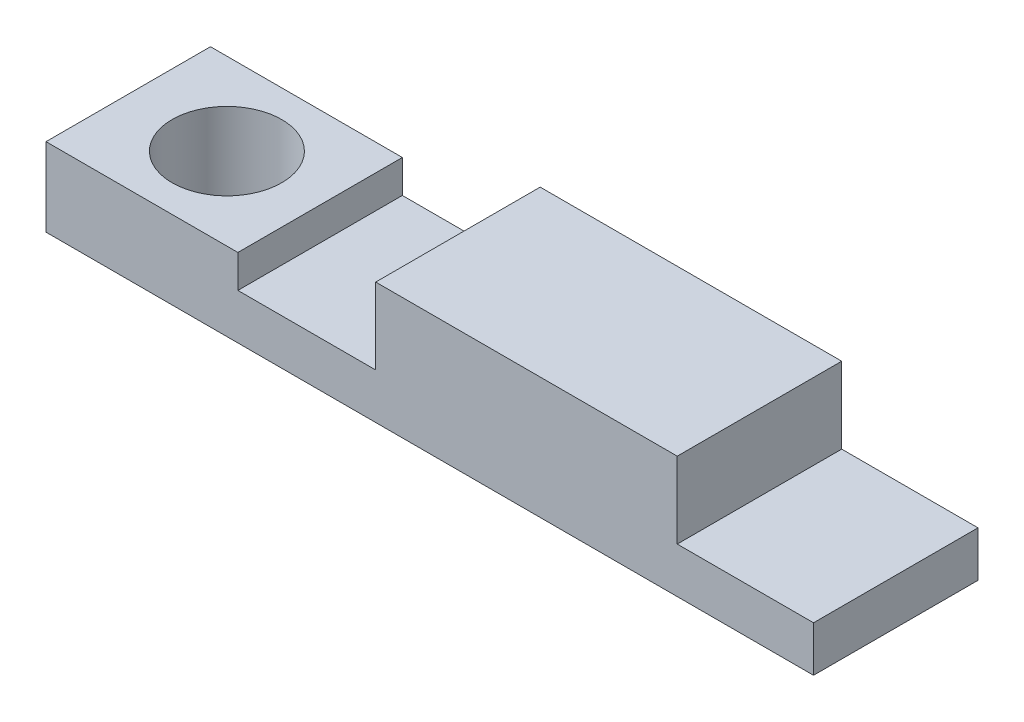
ISO-10303-21;
HEADER;
FILE_DESCRIPTION(('STEP AP214'),'2;1');
FILE_NAME('part.step','',(''),(''),'','','');
FILE_SCHEMA(('AUTOMOTIVE_DESIGN { 1 0 10303 214 1 1 1 1 }'));
ENDSEC;
DATA;
#1=APPLICATION_CONTEXT('core data for automotive mechanical design processes');
#2=APPLICATION_PROTOCOL_DEFINITION('international standard','automotive_design',2000,#1);
#3=PRODUCT_CONTEXT('',#1,'mechanical');
#4=PRODUCT('Part','Part','',(#3));
#5=PRODUCT_RELATED_PRODUCT_CATEGORY('part','',(#4));
#6=PRODUCT_DEFINITION_FORMATION('','',#4);
#7=PRODUCT_DEFINITION_CONTEXT('part definition',#1,'design');
#8=PRODUCT_DEFINITION('design','',#6,#7);
#9=PRODUCT_DEFINITION_SHAPE('','',#8);
#10=(LENGTH_UNIT() NAMED_UNIT(*) SI_UNIT(.MILLI.,.METRE.));
#11=(NAMED_UNIT(*) PLANE_ANGLE_UNIT() SI_UNIT($,.RADIAN.));
#12=(NAMED_UNIT(*) SI_UNIT($,.STERADIAN.) SOLID_ANGLE_UNIT());
#13=UNCERTAINTY_MEASURE_WITH_UNIT(LENGTH_MEASURE(1.E-05),#10,'distance_accuracy_value','');
#14=(GEOMETRIC_REPRESENTATION_CONTEXT(3) GLOBAL_UNCERTAINTY_ASSIGNED_CONTEXT((#13)) GLOBAL_UNIT_ASSIGNED_CONTEXT((#10,
#11,#12)) REPRESENTATION_CONTEXT('',''));
#15=CARTESIAN_POINT('',(0.,0.,0.));
#16=DIRECTION('',(0.,0.,1.));
#17=DIRECTION('',(1.,0.,0.));
#18=AXIS2_PLACEMENT_3D('',#15,#16,#17);
#19=CARTESIAN_POINT('',(0.,8.3,0.));
#20=DIRECTION('',(0.,-1.,0.));
#21=DIRECTION('',(0.,0.,-1.));
#22=AXIS2_PLACEMENT_3D('',#19,#20,#21);
#23=PLANE('',#22);
#24=DIRECTION('',(0.,0.,1.));
#25=VECTOR('',#24,1.);
#26=CARTESIAN_POINT('',(60.14,8.3,-30.));
#27=LINE('',#26,#25);
#28=CARTESIAN_POINT('',(60.14,8.3,-30.));
#29=VERTEX_POINT('',#28);
#30=CARTESIAN_POINT('',(60.14,8.3,0.));
#31=VERTEX_POINT('',#30);
#32=EDGE_CURVE('E120',#29,#31,#27,.T.);
#33=ORIENTED_EDGE('',*,*,#32,.F.);
#34=DIRECTION('',(-1.,0.,0.));
#35=VECTOR('',#34,1.);
#36=CARTESIAN_POINT('',(0.,8.3,-30.));
#37=LINE('',#36,#35);
#38=CARTESIAN_POINT('',(35.,8.3,-30.));
#39=VERTEX_POINT('',#38);
#40=EDGE_CURVE('E192',#29,#39,#37,.T.);
#41=ORIENTED_EDGE('',*,*,#40,.T.);
#42=DIRECTION('',(0.,0.,-1.));
#43=VECTOR('',#42,1.);
#44=CARTESIAN_POINT('',(35.,8.3,0.));
#45=LINE('',#44,#43);
#46=CARTESIAN_POINT('',(35.,8.3,0.));
#47=VERTEX_POINT('',#46);
#48=EDGE_CURVE('E161',#47,#39,#45,.T.);
#49=ORIENTED_EDGE('',*,*,#48,.F.);
#50=DIRECTION('',(1.,0.,0.));
#51=VECTOR('',#50,1.);
#52=CARTESIAN_POINT('',(0.,8.3,0.));
#53=LINE('',#52,#51);
#54=EDGE_CURVE('E59',#47,#31,#53,.T.);
#55=ORIENTED_EDGE('',*,*,#54,.T.);
#56=EDGE_LOOP('',(#33,#41,#49,#55));
#57=FACE_BOUND('',#56,.T.);
#58=ADVANCED_FACE('F33',(#57),#23,.F.);
#59=DIRECTION('',(0.,0.,-1.));
#60=VECTOR('',#59,1.);
#61=CARTESIAN_POINT('',(115.14,8.3,-30.));
#62=LINE('',#61,#60);
#63=CARTESIAN_POINT('',(115.14,8.3,0.));
#64=VERTEX_POINT('',#63);
#65=CARTESIAN_POINT('',(115.14,8.3,-30.));
#66=VERTEX_POINT('',#65);
#67=EDGE_CURVE('E51',#64,#66,#62,.T.);
#68=ORIENTED_EDGE('',*,*,#67,.F.);
#69=CARTESIAN_POINT('',(140.,8.3,0.));
#70=VERTEX_POINT('',#69);
#71=EDGE_CURVE('E37',#64,#70,#53,.T.);
#72=ORIENTED_EDGE('',*,*,#71,.T.);
#73=DIRECTION('',(0.,0.,-1.));
#74=VECTOR('',#73,1.);
#75=CARTESIAN_POINT('',(140.,8.3,0.));
#76=LINE('',#75,#74);
#77=CARTESIAN_POINT('',(140.,8.3,-30.));
#78=VERTEX_POINT('',#77);
#79=EDGE_CURVE('E193',#70,#78,#76,.T.);
#80=ORIENTED_EDGE('',*,*,#79,.T.);
#81=EDGE_CURVE('E180',#78,#66,#37,.T.);
#82=ORIENTED_EDGE('',*,*,#81,.T.);
#83=EDGE_LOOP('',(#68,#72,#80,#82));
#84=FACE_BOUND('',#83,.T.);
#85=ADVANCED_FACE('F213',(#84),#23,.F.);
#86=CARTESIAN_POINT('',(0.,0.,0.));
#87=DIRECTION('',(0.,-1.,0.));
#88=DIRECTION('',(0.,0.,-1.));
#89=AXIS2_PLACEMENT_3D('',#86,#87,#88);
#90=PLANE('',#89);
#91=CARTESIAN_POINT('',(18.,0.,-15.));
#92=DIRECTION('',(0.,1.,0.));
#93=DIRECTION('',(0.,0.,1.));
#94=AXIS2_PLACEMENT_3D('',#91,#92,#93);
#95=CIRCLE('',#94,10.);
#96=CARTESIAN_POINT('',(18.,0.,-5.));
#97=VERTEX_POINT('',#96);
#98=EDGE_CURVE('E155',#97,#97,#95,.T.);
#99=ORIENTED_EDGE('',*,*,#98,.T.);
#100=EDGE_LOOP('',(#99));
#101=FACE_BOUND('',#100,.T.);
#102=DIRECTION('',(0.,0.,1.));
#103=VECTOR('',#102,1.);
#104=CARTESIAN_POINT('',(0.,0.,0.));
#105=LINE('',#104,#103);
#106=CARTESIAN_POINT('',(0.,0.,-30.));
#107=VERTEX_POINT('',#106);
#108=CARTESIAN_POINT('',(0.,0.,0.));
#109=VERTEX_POINT('',#108);
#110=EDGE_CURVE('E190',#107,#109,#105,.T.);
#111=ORIENTED_EDGE('',*,*,#110,.F.);
#112=DIRECTION('',(-1.,0.,0.));
#113=VECTOR('',#112,1.);
#114=CARTESIAN_POINT('',(0.,0.,-30.));
#115=LINE('',#114,#113);
#116=CARTESIAN_POINT('',(140.,0.,-30.));
#117=VERTEX_POINT('',#116);
#118=EDGE_CURVE('E203',#117,#107,#115,.T.);
#119=ORIENTED_EDGE('',*,*,#118,.F.);
#120=DIRECTION('',(0.,0.,-1.));
#121=VECTOR('',#120,1.);
#122=CARTESIAN_POINT('',(140.,0.,0.));
#123=LINE('',#122,#121);
#124=CARTESIAN_POINT('',(140.,0.,0.));
#125=VERTEX_POINT('',#124);
#126=EDGE_CURVE('E201',#125,#117,#123,.T.);
#127=ORIENTED_EDGE('',*,*,#126,.F.);
#128=DIRECTION('',(1.,0.,0.));
#129=VECTOR('',#128,1.);
#130=CARTESIAN_POINT('',(0.,0.,0.));
#131=LINE('',#130,#129);
#132=EDGE_CURVE('E199',#109,#125,#131,.T.);
#133=ORIENTED_EDGE('',*,*,#132,.F.);
#134=EDGE_LOOP('',(#111,#119,#127,#133));
#135=FACE_BOUND('',#134,.T.);
#136=CARTESIAN_POINT('',(80.14,0.,-15.));
#137=DIRECTION('',(0.,1.,0.));
#138=DIRECTION('',(0.,0.,1.));
#139=AXIS2_PLACEMENT_3D('',#136,#137,#138);
#140=CIRCLE('',#139,9.99999999999999);
#141=CARTESIAN_POINT('',(80.14,0.,-5.00000000000001));
#142=VERTEX_POINT('',#141);
#143=EDGE_CURVE('E122',#142,#142,#140,.T.);
#144=ORIENTED_EDGE('',*,*,#143,.T.);
#145=EDGE_LOOP('',(#144));
#146=FACE_BOUND('',#145,.T.);
#147=ADVANCED_FACE('F233',(#101,#135,#146),#90,.T.);
#148=CARTESIAN_POINT('',(0.,14.3,0.));
#149=DIRECTION('',(0.,-1.,0.));
#150=DIRECTION('',(0.,0.,-1.));
#151=AXIS2_PLACEMENT_3D('',#148,#149,#150);
#152=PLANE('',#151);
#153=DIRECTION('',(0.,0.,1.));
#154=VECTOR('',#153,1.);
#155=CARTESIAN_POINT('',(0.,14.3,0.));
#156=LINE('',#155,#154);
#157=CARTESIAN_POINT('',(0.,14.3,-30.));
#158=VERTEX_POINT('',#157);
#159=CARTESIAN_POINT('',(0.,14.3,0.));
#160=VERTEX_POINT('',#159);
#161=EDGE_CURVE('E162',#158,#160,#156,.T.);
#162=ORIENTED_EDGE('',*,*,#161,.T.);
#163=DIRECTION('',(1.,0.,0.));
#164=VECTOR('',#163,1.);
#165=CARTESIAN_POINT('',(0.,14.3,0.));
#166=LINE('',#165,#164);
#167=CARTESIAN_POINT('',(35.,14.3,0.));
#168=VERTEX_POINT('',#167);
#169=EDGE_CURVE('E165',#160,#168,#166,.T.);
#170=ORIENTED_EDGE('',*,*,#169,.T.);
#171=DIRECTION('',(0.,0.,-1.));
#172=VECTOR('',#171,1.);
#173=CARTESIAN_POINT('',(35.,14.3,0.));
#174=LINE('',#173,#172);
#175=CARTESIAN_POINT('',(35.,14.3,-30.));
#176=VERTEX_POINT('',#175);
#177=EDGE_CURVE('E167',#168,#176,#174,.T.);
#178=ORIENTED_EDGE('',*,*,#177,.T.);
#179=DIRECTION('',(-1.,0.,0.));
#180=VECTOR('',#179,1.);
#181=CARTESIAN_POINT('',(0.,14.3,-30.));
#182=LINE('',#181,#180);
#183=EDGE_CURVE('E169',#176,#158,#182,.T.);
#184=ORIENTED_EDGE('',*,*,#183,.T.);
#185=EDGE_LOOP('',(#162,#170,#178,#184));
#186=FACE_BOUND('',#185,.T.);
#187=CARTESIAN_POINT('',(18.,14.3,-15.));
#188=DIRECTION('',(0.,1.,0.));
#189=DIRECTION('',(0.,0.,1.));
#190=AXIS2_PLACEMENT_3D('',#187,#188,#189);
#191=CIRCLE('',#190,10.);
#192=CARTESIAN_POINT('',(18.,14.3,-5.));
#193=VERTEX_POINT('',#192);
#194=EDGE_CURVE('E158',#193,#193,#191,.T.);
#195=ORIENTED_EDGE('',*,*,#194,.F.);
#196=EDGE_LOOP('',(#195));
#197=FACE_BOUND('',#196,.T.);
#198=ADVANCED_FACE('F240',(#186,#197),#152,.F.);
#199=CARTESIAN_POINT('',(0.,8.3,0.));
#200=DIRECTION('',(1.,0.,0.));
#201=DIRECTION('',(0.,0.,-1.));
#202=AXIS2_PLACEMENT_3D('',#199,#200,#201);
#203=PLANE('',#202);
#204=ORIENTED_EDGE('',*,*,#110,.T.);
#205=DIRECTION('',(0.,-1.,0.));
#206=VECTOR('',#205,1.);
#207=CARTESIAN_POINT('',(0.,8.3,0.));
#208=LINE('',#207,#206);
#209=EDGE_CURVE('E11',#160,#109,#208,.T.);
#210=ORIENTED_EDGE('',*,*,#209,.F.);
#211=ORIENTED_EDGE('',*,*,#161,.F.);
#212=DIRECTION('',(0.,-1.,0.));
#213=VECTOR('',#212,1.);
#214=CARTESIAN_POINT('',(0.,8.3,-30.));
#215=LINE('',#214,#213);
#216=EDGE_CURVE('E205',#158,#107,#215,.T.);
#217=ORIENTED_EDGE('',*,*,#216,.T.);
#218=EDGE_LOOP('',(#204,#210,#211,#217));
#219=FACE_BOUND('',#218,.T.);
#220=ADVANCED_FACE('F35',(#219),#203,.F.);
#221=CARTESIAN_POINT('',(0.,8.3,0.));
#222=DIRECTION('',(0.,0.,-1.));
#223=DIRECTION('',(-1.,0.,0.));
#224=AXIS2_PLACEMENT_3D('',#221,#222,#223);
#225=PLANE('',#224);
#226=ORIENTED_EDGE('',*,*,#132,.T.);
#227=DIRECTION('',(0.,-1.,0.));
#228=VECTOR('',#227,1.);
#229=CARTESIAN_POINT('',(140.,8.3,0.));
#230=LINE('',#229,#228);
#231=EDGE_CURVE('E43',#70,#125,#230,.T.);
#232=ORIENTED_EDGE('',*,*,#231,.F.);
#233=ORIENTED_EDGE('',*,*,#71,.F.);
#234=DIRECTION('',(0.,-1.,0.));
#235=VECTOR('',#234,1.);
#236=CARTESIAN_POINT('',(115.14,12.19,0.));
#237=LINE('',#236,#235);
#238=CARTESIAN_POINT('',(115.14,22.19,0.));
#239=VERTEX_POINT('',#238);
#240=EDGE_CURVE('E123',#239,#64,#237,.T.);
#241=ORIENTED_EDGE('',*,*,#240,.F.);
#242=DIRECTION('',(1.,0.,0.));
#243=VECTOR('',#242,1.);
#244=CARTESIAN_POINT('',(60.14,22.19,0.));
#245=LINE('',#244,#243);
#246=CARTESIAN_POINT('',(60.14,22.19,0.));
#247=VERTEX_POINT('',#246);
#248=EDGE_CURVE('E126',#247,#239,#245,.T.);
#249=ORIENTED_EDGE('',*,*,#248,.F.);
#250=DIRECTION('',(0.,-1.,0.));
#251=VECTOR('',#250,1.);
#252=CARTESIAN_POINT('',(60.14,12.19,0.));
#253=LINE('',#252,#251);
#254=EDGE_CURVE('E114',#247,#31,#253,.T.);
#255=ORIENTED_EDGE('',*,*,#254,.T.);
#256=ORIENTED_EDGE('',*,*,#54,.F.);
#257=DIRECTION('',(0.,-1.,0.));
#258=VECTOR('',#257,1.);
#259=CARTESIAN_POINT('',(35.,14.3,0.));
#260=LINE('',#259,#258);
#261=EDGE_CURVE('E185',#168,#47,#260,.T.);
#262=ORIENTED_EDGE('',*,*,#261,.F.);
#263=ORIENTED_EDGE('',*,*,#169,.F.);
#264=ORIENTED_EDGE('',*,*,#209,.T.);
#265=EDGE_LOOP('',(#226,#232,#233,#241,#249,#255,#256,#262,#263,#264));
#266=FACE_BOUND('',#265,.T.);
#267=ADVANCED_FACE('F127',(#266),#225,.F.);
#268=CARTESIAN_POINT('',(140.,8.3,0.));
#269=DIRECTION('',(-1.,0.,0.));
#270=DIRECTION('',(0.,0.,1.));
#271=AXIS2_PLACEMENT_3D('',#268,#269,#270);
#272=PLANE('',#271);
#273=ORIENTED_EDGE('',*,*,#126,.T.);
#274=DIRECTION('',(0.,-1.,0.));
#275=VECTOR('',#274,1.);
#276=CARTESIAN_POINT('',(140.,8.3,-30.));
#277=LINE('',#276,#275);
#278=EDGE_CURVE('E208',#78,#117,#277,.T.);
#279=ORIENTED_EDGE('',*,*,#278,.F.);
#280=ORIENTED_EDGE('',*,*,#79,.F.);
#281=ORIENTED_EDGE('',*,*,#231,.T.);
#282=EDGE_LOOP('',(#273,#279,#280,#281));
#283=FACE_BOUND('',#282,.T.);
#284=ADVANCED_FACE('F218',(#283),#272,.F.);
#285=CARTESIAN_POINT('',(0.,8.3,-30.));
#286=DIRECTION('',(0.,0.,1.));
#287=DIRECTION('',(1.,0.,0.));
#288=AXIS2_PLACEMENT_3D('',#285,#286,#287);
#289=PLANE('',#288);
#290=ORIENTED_EDGE('',*,*,#118,.T.);
#291=ORIENTED_EDGE('',*,*,#216,.F.);
#292=ORIENTED_EDGE('',*,*,#183,.F.);
#293=DIRECTION('',(0.,-1.,0.));
#294=VECTOR('',#293,1.);
#295=CARTESIAN_POINT('',(35.,14.3,-30.));
#296=LINE('',#295,#294);
#297=EDGE_CURVE('E172',#176,#39,#296,.T.);
#298=ORIENTED_EDGE('',*,*,#297,.T.);
#299=ORIENTED_EDGE('',*,*,#40,.F.);
#300=DIRECTION('',(0.,-1.,0.));
#301=VECTOR('',#300,1.);
#302=CARTESIAN_POINT('',(60.14,12.19,-30.));
#303=LINE('',#302,#301);
#304=CARTESIAN_POINT('',(60.14,22.19,-30.));
#305=VERTEX_POINT('',#304);
#306=EDGE_CURVE('E147',#305,#29,#303,.T.);
#307=ORIENTED_EDGE('',*,*,#306,.F.);
#308=DIRECTION('',(-1.,0.,0.));
#309=VECTOR('',#308,1.);
#310=CARTESIAN_POINT('',(60.14,22.19,-30.));
#311=LINE('',#310,#309);
#312=CARTESIAN_POINT('',(115.14,22.19,-30.));
#313=VERTEX_POINT('',#312);
#314=EDGE_CURVE('E137',#313,#305,#311,.T.);
#315=ORIENTED_EDGE('',*,*,#314,.F.);
#316=DIRECTION('',(0.,-1.,0.));
#317=VECTOR('',#316,1.);
#318=CARTESIAN_POINT('',(115.14,12.19,-30.));
#319=LINE('',#318,#317);
#320=EDGE_CURVE('E149',#313,#66,#319,.T.);
#321=ORIENTED_EDGE('',*,*,#320,.T.);
#322=ORIENTED_EDGE('',*,*,#81,.F.);
#323=ORIENTED_EDGE('',*,*,#278,.T.);
#324=EDGE_LOOP('',(#290,#291,#292,#298,#299,#307,#315,#321,#322,#323));
#325=FACE_BOUND('',#324,.T.);
#326=ADVANCED_FACE('F222',(#325),#289,.F.);
#327=CARTESIAN_POINT('',(35.,14.3,0.));
#328=DIRECTION('',(-1.,0.,0.));
#329=DIRECTION('',(0.,0.,1.));
#330=AXIS2_PLACEMENT_3D('',#327,#328,#329);
#331=PLANE('',#330);
#332=ORIENTED_EDGE('',*,*,#48,.T.);
#333=ORIENTED_EDGE('',*,*,#297,.F.);
#334=ORIENTED_EDGE('',*,*,#177,.F.);
#335=ORIENTED_EDGE('',*,*,#261,.T.);
#336=EDGE_LOOP('',(#332,#333,#334,#335));
#337=FACE_BOUND('',#336,.T.);
#338=ADVANCED_FACE('F236',(#337),#331,.F.);
#339=CARTESIAN_POINT('',(18.,14.3,-15.));
#340=DIRECTION('',(0.,-1.,0.));
#341=DIRECTION('',(0.,0.,-1.));
#342=AXIS2_PLACEMENT_3D('',#339,#340,#341);
#343=CYLINDRICAL_SURFACE('',#342,10.);
#344=ORIENTED_EDGE('',*,*,#194,.T.);
#345=EDGE_LOOP('',(#344));
#346=FACE_BOUND('',#345,.T.);
#347=ORIENTED_EDGE('',*,*,#98,.F.);
#348=EDGE_LOOP('',(#347));
#349=FACE_BOUND('',#348,.T.);
#350=ADVANCED_FACE('F264',(#346,#349),#343,.F.);
#351=CARTESIAN_POINT('',(80.14,14.3,-15.));
#352=DIRECTION('',(0.,-1.,0.));
#353=DIRECTION('',(0.,0.,-1.));
#354=AXIS2_PLACEMENT_3D('',#351,#352,#353);
#355=CYLINDRICAL_SURFACE('',#354,9.99999999999999);
#356=ORIENTED_EDGE('',*,*,#143,.F.);
#357=EDGE_LOOP('',(#356));
#358=FACE_BOUND('',#357,.T.);
#359=CARTESIAN_POINT('',(80.14,12.19,-15.));
#360=DIRECTION('',(0.,1.,0.));
#361=DIRECTION('',(0.,0.,1.));
#362=AXIS2_PLACEMENT_3D('',#359,#360,#361);
#363=CIRCLE('',#362,9.99999999999999);
#364=CARTESIAN_POINT('',(80.14,12.19,-5.00000000000001));
#365=VERTEX_POINT('',#364);
#366=EDGE_CURVE('E142',#365,#365,#363,.T.);
#367=ORIENTED_EDGE('',*,*,#366,.T.);
#368=EDGE_LOOP('',(#367));
#369=FACE_BOUND('',#368,.T.);
#370=ADVANCED_FACE('F268',(#358,#369),#355,.F.);
#371=CARTESIAN_POINT('',(60.14,12.19,-30.));
#372=DIRECTION('',(1.,0.,0.));
#373=DIRECTION('',(0.,0.,-1.));
#374=AXIS2_PLACEMENT_3D('',#371,#372,#373);
#375=PLANE('',#374);
#376=ORIENTED_EDGE('',*,*,#32,.T.);
#377=ORIENTED_EDGE('',*,*,#254,.F.);
#378=DIRECTION('',(0.,0.,1.));
#379=VECTOR('',#378,1.);
#380=CARTESIAN_POINT('',(60.14,22.19,-30.));
#381=LINE('',#380,#379);
#382=EDGE_CURVE('E119',#305,#247,#381,.T.);
#383=ORIENTED_EDGE('',*,*,#382,.F.);
#384=ORIENTED_EDGE('',*,*,#306,.T.);
#385=EDGE_LOOP('',(#376,#377,#383,#384));
#386=FACE_BOUND('',#385,.T.);
#387=ADVANCED_FACE('F116',(#386),#375,.F.);
#388=CARTESIAN_POINT('',(115.14,12.19,-30.));
#389=DIRECTION('',(-1.,0.,0.));
#390=DIRECTION('',(0.,0.,1.));
#391=AXIS2_PLACEMENT_3D('',#388,#389,#390);
#392=PLANE('',#391);
#393=ORIENTED_EDGE('',*,*,#67,.T.);
#394=ORIENTED_EDGE('',*,*,#320,.F.);
#395=DIRECTION('',(0.,0.,-1.));
#396=VECTOR('',#395,1.);
#397=CARTESIAN_POINT('',(115.14,22.19,-30.));
#398=LINE('',#397,#396);
#399=EDGE_CURVE('E132',#239,#313,#398,.T.);
#400=ORIENTED_EDGE('',*,*,#399,.F.);
#401=ORIENTED_EDGE('',*,*,#240,.T.);
#402=EDGE_LOOP('',(#393,#394,#400,#401));
#403=FACE_BOUND('',#402,.T.);
#404=ADVANCED_FACE('F224',(#403),#392,.F.);
#405=CARTESIAN_POINT('',(0.,22.19,0.));
#406=DIRECTION('',(0.,1.,0.));
#407=DIRECTION('',(0.,0.,1.));
#408=AXIS2_PLACEMENT_3D('',#405,#406,#407);
#409=PLANE('',#408);
#410=ORIENTED_EDGE('',*,*,#382,.T.);
#411=ORIENTED_EDGE('',*,*,#248,.T.);
#412=ORIENTED_EDGE('',*,*,#399,.T.);
#413=ORIENTED_EDGE('',*,*,#314,.T.);
#414=EDGE_LOOP('',(#410,#411,#412,#413));
#415=FACE_BOUND('',#414,.T.);
#416=ADVANCED_FACE('F135',(#415),#409,.T.);
#417=CARTESIAN_POINT('',(0.,12.19,0.));
#418=DIRECTION('',(0.,1.,0.));
#419=DIRECTION('',(0.,0.,1.));
#420=AXIS2_PLACEMENT_3D('',#417,#418,#419);
#421=PLANE('',#420);
#422=ORIENTED_EDGE('',*,*,#366,.F.);
#423=EDGE_LOOP('',(#422));
#424=FACE_BOUND('',#423,.T.);
#425=ADVANCED_FACE('F281',(#424),#421,.F.);
#426=CLOSED_SHELL('',(#58,#85,#147,#198,#220,#267,#284,#326,#338,#350,#370,#387,#404,#416,#425));
#427=MANIFOLD_SOLID_BREP('B2',#426);
#428=ADVANCED_BREP_SHAPE_REPRESENTATION('',(#18,#427),#14);
#429=SHAPE_DEFINITION_REPRESENTATION(#9,#428);
ENDSEC;
END-ISO-10303-21;
